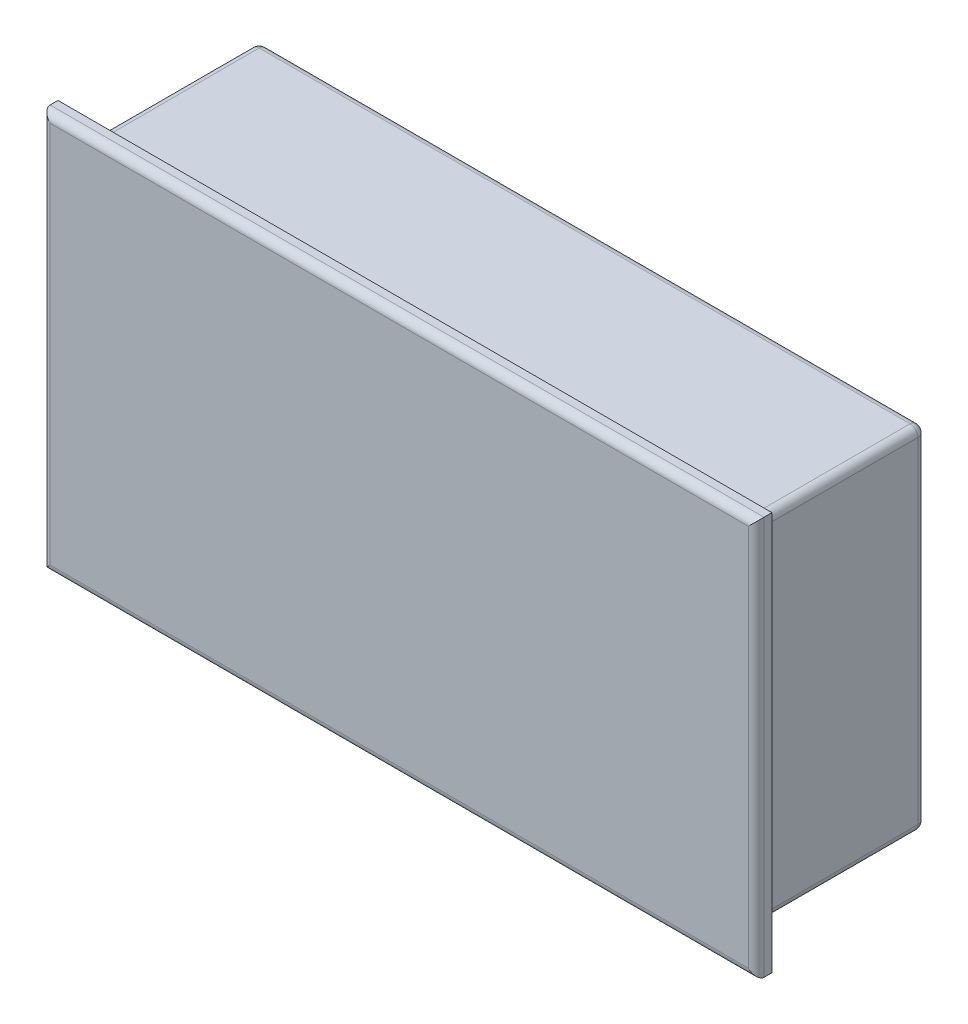
ISO-10303-21;
HEADER;
FILE_DESCRIPTION(('STEP AP214'),'2;1');
FILE_NAME('part.step','',(''),(''),'','','');
FILE_SCHEMA(('AUTOMOTIVE_DESIGN { 1 0 10303 214 1 1 1 1 }'));
ENDSEC;
DATA;
#1=APPLICATION_CONTEXT('core data for automotive mechanical design processes');
#2=APPLICATION_PROTOCOL_DEFINITION('international standard','automotive_design',2000,#1);
#3=PRODUCT_CONTEXT('',#1,'mechanical');
#4=PRODUCT('Part','Part','',(#3));
#5=PRODUCT_RELATED_PRODUCT_CATEGORY('part','',(#4));
#6=PRODUCT_DEFINITION_FORMATION('','',#4);
#7=PRODUCT_DEFINITION_CONTEXT('part definition',#1,'design');
#8=PRODUCT_DEFINITION('design','',#6,#7);
#9=PRODUCT_DEFINITION_SHAPE('','',#8);
#10=(LENGTH_UNIT() NAMED_UNIT(*) SI_UNIT(.MILLI.,.METRE.));
#11=(NAMED_UNIT(*) PLANE_ANGLE_UNIT() SI_UNIT($,.RADIAN.));
#12=(NAMED_UNIT(*) SI_UNIT($,.STERADIAN.) SOLID_ANGLE_UNIT());
#13=UNCERTAINTY_MEASURE_WITH_UNIT(LENGTH_MEASURE(1.E-05),#10,'distance_accuracy_value','');
#14=(GEOMETRIC_REPRESENTATION_CONTEXT(3) GLOBAL_UNCERTAINTY_ASSIGNED_CONTEXT((#13)) GLOBAL_UNIT_ASSIGNED_CONTEXT((#10,
#11,#12)) REPRESENTATION_CONTEXT('',''));
#15=CARTESIAN_POINT('',(0.,0.,0.));
#16=DIRECTION('',(0.,0.,1.));
#17=DIRECTION('',(1.,0.,0.));
#18=AXIS2_PLACEMENT_3D('',#15,#16,#17);
#19=CARTESIAN_POINT('',(42.25,22.25,-22.5));
#20=DIRECTION('',(1.,0.,0.));
#21=DIRECTION('',(0.,0.,-1.));
#22=AXIS2_PLACEMENT_3D('',#19,#20,#21);
#23=PLANE('',#22);
#24=DIRECTION('',(0.,1.,0.));
#25=VECTOR('',#24,1.);
#26=CARTESIAN_POINT('',(42.25,22.25,-21.5));
#27=LINE('',#26,#25);
#28=CARTESIAN_POINT('',(42.25,-21.25,-21.5));
#29=VERTEX_POINT('',#28);
#30=CARTESIAN_POINT('',(42.25,21.25,-21.5));
#31=VERTEX_POINT('',#30);
#32=EDGE_CURVE('E224',#29,#31,#27,.T.);
#33=ORIENTED_EDGE('',*,*,#32,.T.);
#34=DIRECTION('',(0.,0.,1.));
#35=VECTOR('',#34,1.);
#36=CARTESIAN_POINT('',(42.25,21.25,-22.5));
#37=LINE('',#36,#35);
#38=CARTESIAN_POINT('',(42.25,21.25,0.));
#39=VERTEX_POINT('',#38);
#40=EDGE_CURVE('E226',#31,#39,#37,.T.);
#41=ORIENTED_EDGE('',*,*,#40,.T.);
#42=DIRECTION('',(0.,1.,0.));
#43=VECTOR('',#42,1.);
#44=CARTESIAN_POINT('',(42.25,22.25,0.));
#45=LINE('',#44,#43);
#46=CARTESIAN_POINT('',(42.25,-21.25,0.));
#47=VERTEX_POINT('',#46);
#48=EDGE_CURVE('E154',#47,#39,#45,.T.);
#49=ORIENTED_EDGE('',*,*,#48,.F.);
#50=DIRECTION('',(0.,0.,1.));
#51=VECTOR('',#50,1.);
#52=CARTESIAN_POINT('',(42.25,-21.25,-22.5));
#53=LINE('',#52,#51);
#54=EDGE_CURVE('E222',#47,#29,#53,.F.);
#55=ORIENTED_EDGE('',*,*,#54,.T.);
#56=EDGE_LOOP('',(#33,#41,#49,#55));
#57=FACE_BOUND('',#56,.T.);
#58=ADVANCED_FACE('F33',(#57),#23,.T.);
#59=CARTESIAN_POINT('',(-42.25,-22.25,-22.5));
#60=DIRECTION('',(0.,-1.,0.));
#61=DIRECTION('',(0.,0.,-1.));
#62=AXIS2_PLACEMENT_3D('',#59,#60,#61);
#63=PLANE('',#62);
#64=DIRECTION('',(1.,0.,0.));
#65=VECTOR('',#64,1.);
#66=CARTESIAN_POINT('',(-42.25,-22.25,0.));
#67=LINE('',#66,#65);
#68=CARTESIAN_POINT('',(-41.25,-22.25,0.));
#69=VERTEX_POINT('',#68);
#70=CARTESIAN_POINT('',(41.25,-22.25,0.));
#71=VERTEX_POINT('',#70);
#72=EDGE_CURVE('E191',#69,#71,#67,.T.);
#73=ORIENTED_EDGE('',*,*,#72,.F.);
#74=DIRECTION('',(0.,0.,1.));
#75=VECTOR('',#74,1.);
#76=CARTESIAN_POINT('',(-41.25,-22.25,-22.5));
#77=LINE('',#76,#75);
#78=CARTESIAN_POINT('',(-41.25,-22.25,-21.5));
#79=VERTEX_POINT('',#78);
#80=EDGE_CURVE('E220',#69,#79,#77,.F.);
#81=ORIENTED_EDGE('',*,*,#80,.T.);
#82=DIRECTION('',(1.,0.,0.));
#83=VECTOR('',#82,1.);
#84=CARTESIAN_POINT('',(42.25,-22.25,-21.5));
#85=LINE('',#84,#83);
#86=CARTESIAN_POINT('',(41.25,-22.25,-21.5));
#87=VERTEX_POINT('',#86);
#88=EDGE_CURVE('E218',#79,#87,#85,.T.);
#89=ORIENTED_EDGE('',*,*,#88,.T.);
#90=DIRECTION('',(0.,0.,1.));
#91=VECTOR('',#90,1.);
#92=CARTESIAN_POINT('',(41.25,-22.25,-22.5));
#93=LINE('',#92,#91);
#94=EDGE_CURVE('E216',#87,#71,#93,.T.);
#95=ORIENTED_EDGE('',*,*,#94,.T.);
#96=EDGE_LOOP('',(#73,#81,#89,#95));
#97=FACE_BOUND('',#96,.T.);
#98=ADVANCED_FACE('F319',(#97),#63,.T.);
#99=CARTESIAN_POINT('',(-42.25,22.25,-22.5));
#100=DIRECTION('',(-1.,0.,0.));
#101=DIRECTION('',(0.,-1.,0.));
#102=AXIS2_PLACEMENT_3D('',#99,#100,#101);
#103=PLANE('',#102);
#104=DIRECTION('',(0.,-1.,0.));
#105=VECTOR('',#104,1.);
#106=CARTESIAN_POINT('',(-42.25,-22.25,-21.5));
#107=LINE('',#106,#105);
#108=CARTESIAN_POINT('',(-42.25,21.25,-21.5));
#109=VERTEX_POINT('',#108);
#110=CARTESIAN_POINT('',(-42.25,-21.25,-21.5));
#111=VERTEX_POINT('',#110);
#112=EDGE_CURVE('E212',#109,#111,#107,.T.);
#113=ORIENTED_EDGE('',*,*,#112,.T.);
#114=DIRECTION('',(0.,0.,1.));
#115=VECTOR('',#114,1.);
#116=CARTESIAN_POINT('',(-42.25,-21.25,-22.5));
#117=LINE('',#116,#115);
#118=CARTESIAN_POINT('',(-42.25,-21.25,0.));
#119=VERTEX_POINT('',#118);
#120=EDGE_CURVE('E214',#111,#119,#117,.T.);
#121=ORIENTED_EDGE('',*,*,#120,.T.);
#122=DIRECTION('',(0.,-1.,0.));
#123=VECTOR('',#122,1.);
#124=CARTESIAN_POINT('',(-42.25,22.25,0.));
#125=LINE('',#124,#123);
#126=CARTESIAN_POINT('',(-42.25,21.25,0.));
#127=VERTEX_POINT('',#126);
#128=EDGE_CURVE('E188',#127,#119,#125,.T.);
#129=ORIENTED_EDGE('',*,*,#128,.F.);
#130=DIRECTION('',(0.,0.,1.));
#131=VECTOR('',#130,1.);
#132=CARTESIAN_POINT('',(-42.25,21.25,-22.5));
#133=LINE('',#132,#131);
#134=EDGE_CURVE('E210',#127,#109,#133,.F.);
#135=ORIENTED_EDGE('',*,*,#134,.T.);
#136=EDGE_LOOP('',(#113,#121,#129,#135));
#137=FACE_BOUND('',#136,.T.);
#138=ADVANCED_FACE('F325',(#137),#103,.T.);
#139=CARTESIAN_POINT('',(-42.25,22.25,-22.5));
#140=DIRECTION('',(0.,1.,0.));
#141=DIRECTION('',(0.,0.,1.));
#142=AXIS2_PLACEMENT_3D('',#139,#140,#141);
#143=PLANE('',#142);
#144=DIRECTION('',(-1.,0.,0.));
#145=VECTOR('',#144,1.);
#146=CARTESIAN_POINT('',(-42.25,22.25,0.));
#147=LINE('',#146,#145);
#148=CARTESIAN_POINT('',(41.25,22.25,0.));
#149=VERTEX_POINT('',#148);
#150=CARTESIAN_POINT('',(-41.25,22.25,0.));
#151=VERTEX_POINT('',#150);
#152=EDGE_CURVE('E185',#149,#151,#147,.T.);
#153=ORIENTED_EDGE('',*,*,#152,.F.);
#154=DIRECTION('',(0.,0.,1.));
#155=VECTOR('',#154,1.);
#156=CARTESIAN_POINT('',(41.25,22.25,-22.5));
#157=LINE('',#156,#155);
#158=CARTESIAN_POINT('',(41.25,22.25,-21.5));
#159=VERTEX_POINT('',#158);
#160=EDGE_CURVE('E199',#149,#159,#157,.F.);
#161=ORIENTED_EDGE('',*,*,#160,.T.);
#162=DIRECTION('',(-1.,0.,0.));
#163=VECTOR('',#162,1.);
#164=CARTESIAN_POINT('',(-42.25,22.25,-21.5));
#165=LINE('',#164,#163);
#166=CARTESIAN_POINT('',(-41.25,22.25,-21.5));
#167=VERTEX_POINT('',#166);
#168=EDGE_CURVE('E196',#159,#167,#165,.T.);
#169=ORIENTED_EDGE('',*,*,#168,.T.);
#170=DIRECTION('',(0.,0.,1.));
#171=VECTOR('',#170,1.);
#172=CARTESIAN_POINT('',(-41.25,22.25,-22.5));
#173=LINE('',#172,#171);
#174=EDGE_CURVE('E194',#167,#151,#173,.T.);
#175=ORIENTED_EDGE('',*,*,#174,.T.);
#176=EDGE_LOOP('',(#153,#161,#169,#175));
#177=FACE_BOUND('',#176,.T.);
#178=ADVANCED_FACE('F330',(#177),#143,.T.);
#179=CARTESIAN_POINT('',(0.,0.,-22.5));
#180=DIRECTION('',(0.,0.,1.));
#181=DIRECTION('',(1.,0.,0.));
#182=AXIS2_PLACEMENT_3D('',#179,#180,#181);
#183=PLANE('',#182);
#184=DIRECTION('',(0.,-1.,0.));
#185=VECTOR('',#184,1.);
#186=CARTESIAN_POINT('',(-41.25,22.25,-22.5));
#187=LINE('',#186,#185);
#188=CARTESIAN_POINT('',(-41.25,-21.25,-22.5));
#189=VERTEX_POINT('',#188);
#190=CARTESIAN_POINT('',(-41.25,21.25,-22.5));
#191=VERTEX_POINT('',#190);
#192=EDGE_CURVE('E205',#189,#191,#187,.F.);
#193=ORIENTED_EDGE('',*,*,#192,.T.);
#194=DIRECTION('',(-1.,0.,0.));
#195=VECTOR('',#194,1.);
#196=CARTESIAN_POINT('',(42.25,21.25,-22.5));
#197=LINE('',#196,#195);
#198=CARTESIAN_POINT('',(41.25,21.25,-22.5));
#199=VERTEX_POINT('',#198);
#200=EDGE_CURVE('E207',#191,#199,#197,.F.);
#201=ORIENTED_EDGE('',*,*,#200,.T.);
#202=DIRECTION('',(0.,1.,0.));
#203=VECTOR('',#202,1.);
#204=CARTESIAN_POINT('',(41.25,-22.25,-22.5));
#205=LINE('',#204,#203);
#206=CARTESIAN_POINT('',(41.25,-21.25,-22.5));
#207=VERTEX_POINT('',#206);
#208=EDGE_CURVE('E201',#199,#207,#205,.F.);
#209=ORIENTED_EDGE('',*,*,#208,.T.);
#210=DIRECTION('',(1.,0.,0.));
#211=VECTOR('',#210,1.);
#212=CARTESIAN_POINT('',(-42.25,-21.25,-22.5));
#213=LINE('',#212,#211);
#214=EDGE_CURVE('E203',#207,#189,#213,.F.);
#215=ORIENTED_EDGE('',*,*,#214,.T.);
#216=EDGE_LOOP('',(#193,#201,#209,#215));
#217=FACE_BOUND('',#216,.T.);
#218=ADVANCED_FACE('F475',(#217),#183,.F.);
#219=CARTESIAN_POINT('',(0.,0.,0.));
#220=DIRECTION('',(0.,0.,1.));
#221=DIRECTION('',(1.,0.,0.));
#222=AXIS2_PLACEMENT_3D('',#219,#220,#221);
#223=PLANE('',#222);
#224=DIRECTION('',(0.,-1.,0.));
#225=VECTOR('',#224,1.);
#226=CARTESIAN_POINT('',(-45.25,-25.25,0.));
#227=LINE('',#226,#225);
#228=CARTESIAN_POINT('',(-45.25,25.25,0.));
#229=VERTEX_POINT('',#228);
#230=CARTESIAN_POINT('',(-45.25,-25.25,0.));
#231=VERTEX_POINT('',#230);
#232=EDGE_CURVE('E162',#229,#231,#227,.T.);
#233=ORIENTED_EDGE('',*,*,#232,.F.);
#234=DIRECTION('',(-1.,0.,0.));
#235=VECTOR('',#234,1.);
#236=CARTESIAN_POINT('',(45.25,25.25,0.));
#237=LINE('',#236,#235);
#238=CARTESIAN_POINT('',(45.25,25.25,0.));
#239=VERTEX_POINT('',#238);
#240=EDGE_CURVE('E177',#239,#229,#237,.T.);
#241=ORIENTED_EDGE('',*,*,#240,.F.);
#242=DIRECTION('',(0.,1.,0.));
#243=VECTOR('',#242,1.);
#244=CARTESIAN_POINT('',(45.25,-25.25,0.));
#245=LINE('',#244,#243);
#246=CARTESIAN_POINT('',(45.25,-25.25,0.));
#247=VERTEX_POINT('',#246);
#248=EDGE_CURVE('E164',#247,#239,#245,.T.);
#249=ORIENTED_EDGE('',*,*,#248,.F.);
#250=DIRECTION('',(1.,0.,0.));
#251=VECTOR('',#250,1.);
#252=CARTESIAN_POINT('',(45.25,-25.25,0.));
#253=LINE('',#252,#251);
#254=EDGE_CURVE('E149',#231,#247,#253,.T.);
#255=ORIENTED_EDGE('',*,*,#254,.F.);
#256=EDGE_LOOP('',(#233,#241,#249,#255));
#257=FACE_BOUND('',#256,.T.);
#258=ORIENTED_EDGE('',*,*,#128,.T.);
#259=CARTESIAN_POINT('',(-41.25,-21.25,0.));
#260=DIRECTION('',(0.,0.,1.));
#261=DIRECTION('',(1.,0.,0.));
#262=AXIS2_PLACEMENT_3D('',#259,#260,#261);
#263=CIRCLE('',#262,1.);
#264=EDGE_CURVE('E244',#119,#69,#263,.T.);
#265=ORIENTED_EDGE('',*,*,#264,.T.);
#266=ORIENTED_EDGE('',*,*,#72,.T.);
#267=CARTESIAN_POINT('',(41.25,-21.25,0.));
#268=DIRECTION('',(0.,0.,1.));
#269=DIRECTION('',(1.,0.,0.));
#270=AXIS2_PLACEMENT_3D('',#267,#268,#269);
#271=CIRCLE('',#270,1.);
#272=EDGE_CURVE('E42',#71,#47,#271,.T.);
#273=ORIENTED_EDGE('',*,*,#272,.T.);
#274=ORIENTED_EDGE('',*,*,#48,.T.);
#275=CARTESIAN_POINT('',(41.25,21.25,0.));
#276=DIRECTION('',(0.,0.,1.));
#277=DIRECTION('',(1.,0.,0.));
#278=AXIS2_PLACEMENT_3D('',#275,#276,#277);
#279=CIRCLE('',#278,1.);
#280=EDGE_CURVE('E246',#39,#149,#279,.T.);
#281=ORIENTED_EDGE('',*,*,#280,.T.);
#282=ORIENTED_EDGE('',*,*,#152,.T.);
#283=CARTESIAN_POINT('',(-41.25,21.25,0.));
#284=DIRECTION('',(0.,0.,1.));
#285=DIRECTION('',(1.,0.,0.));
#286=AXIS2_PLACEMENT_3D('',#283,#284,#285);
#287=CIRCLE('',#286,1.);
#288=EDGE_CURVE('E11',#151,#127,#287,.T.);
#289=ORIENTED_EDGE('',*,*,#288,.T.);
#290=EDGE_LOOP('',(#258,#265,#266,#273,#274,#281,#282,#289));
#291=FACE_BOUND('',#290,.T.);
#292=ADVANCED_FACE('F159',(#257,#291),#223,.F.);
#293=CARTESIAN_POINT('',(-45.25,-25.25,2.));
#294=DIRECTION('',(1.,0.,0.));
#295=DIRECTION('',(0.,0.,-1.));
#296=AXIS2_PLACEMENT_3D('',#293,#294,#295);
#297=PLANE('',#296);
#298=DIRECTION('',(0.,0.,-1.));
#299=VECTOR('',#298,1.);
#300=CARTESIAN_POINT('',(-45.25,-25.25,2.));
#301=LINE('',#300,#299);
#302=CARTESIAN_POINT('',(-45.25,-25.25,1.));
#303=VERTEX_POINT('',#302);
#304=EDGE_CURVE('E146',#303,#231,#301,.T.);
#305=ORIENTED_EDGE('',*,*,#304,.F.);
#306=DIRECTION('',(0.,-1.,0.));
#307=VECTOR('',#306,1.);
#308=CARTESIAN_POINT('',(-45.25,25.25,1.));
#309=LINE('',#308,#307);
#310=CARTESIAN_POINT('',(-45.25,25.25,1.));
#311=VERTEX_POINT('',#310);
#312=EDGE_CURVE('E242',#303,#311,#309,.F.);
#313=ORIENTED_EDGE('',*,*,#312,.T.);
#314=DIRECTION('',(0.,0.,-1.));
#315=VECTOR('',#314,1.);
#316=CARTESIAN_POINT('',(-45.25,25.25,2.));
#317=LINE('',#316,#315);
#318=EDGE_CURVE('E168',#311,#229,#317,.T.);
#319=ORIENTED_EDGE('',*,*,#318,.T.);
#320=ORIENTED_EDGE('',*,*,#232,.T.);
#321=EDGE_LOOP('',(#305,#313,#319,#320));
#322=FACE_BOUND('',#321,.T.);
#323=ADVANCED_FACE('F166',(#322),#297,.F.);
#324=CARTESIAN_POINT('',(45.25,-25.25,2.));
#325=DIRECTION('',(0.,1.,0.));
#326=DIRECTION('',(0.,0.,1.));
#327=AXIS2_PLACEMENT_3D('',#324,#325,#326);
#328=PLANE('',#327);
#329=DIRECTION('',(0.,0.,-1.));
#330=VECTOR('',#329,1.);
#331=CARTESIAN_POINT('',(45.25,-25.25,2.));
#332=LINE('',#331,#330);
#333=CARTESIAN_POINT('',(45.25,-25.25,1.));
#334=VERTEX_POINT('',#333);
#335=EDGE_CURVE('E155',#334,#247,#332,.T.);
#336=ORIENTED_EDGE('',*,*,#335,.F.);
#337=DIRECTION('',(1.,0.,0.));
#338=VECTOR('',#337,1.);
#339=CARTESIAN_POINT('',(-45.25,-25.25,1.));
#340=LINE('',#339,#338);
#341=EDGE_CURVE('E50',#334,#303,#340,.F.);
#342=ORIENTED_EDGE('',*,*,#341,.T.);
#343=ORIENTED_EDGE('',*,*,#304,.T.);
#344=ORIENTED_EDGE('',*,*,#254,.T.);
#345=EDGE_LOOP('',(#336,#342,#343,#344));
#346=FACE_BOUND('',#345,.T.);
#347=ADVANCED_FACE('F148',(#346),#328,.F.);
#348=CARTESIAN_POINT('',(45.25,-25.25,2.));
#349=DIRECTION('',(-1.,0.,0.));
#350=DIRECTION('',(0.,0.,1.));
#351=AXIS2_PLACEMENT_3D('',#348,#349,#350);
#352=PLANE('',#351);
#353=DIRECTION('',(0.,0.,-1.));
#354=VECTOR('',#353,1.);
#355=CARTESIAN_POINT('',(45.25,25.25,2.));
#356=LINE('',#355,#354);
#357=CARTESIAN_POINT('',(45.25,25.25,1.));
#358=VERTEX_POINT('',#357);
#359=EDGE_CURVE('E180',#358,#239,#356,.T.);
#360=ORIENTED_EDGE('',*,*,#359,.F.);
#361=DIRECTION('',(0.,1.,0.));
#362=VECTOR('',#361,1.);
#363=CARTESIAN_POINT('',(45.25,-25.25,1.));
#364=LINE('',#363,#362);
#365=EDGE_CURVE('E58',#358,#334,#364,.F.);
#366=ORIENTED_EDGE('',*,*,#365,.T.);
#367=ORIENTED_EDGE('',*,*,#335,.T.);
#368=ORIENTED_EDGE('',*,*,#248,.T.);
#369=EDGE_LOOP('',(#360,#366,#367,#368));
#370=FACE_BOUND('',#369,.T.);
#371=ADVANCED_FACE('F315',(#370),#352,.F.);
#372=CARTESIAN_POINT('',(45.25,25.25,2.));
#373=DIRECTION('',(0.,-1.,0.));
#374=DIRECTION('',(0.,0.,-1.));
#375=AXIS2_PLACEMENT_3D('',#372,#373,#374);
#376=PLANE('',#375);
#377=ORIENTED_EDGE('',*,*,#318,.F.);
#378=DIRECTION('',(-1.,0.,0.));
#379=VECTOR('',#378,1.);
#380=CARTESIAN_POINT('',(45.25,25.25,1.));
#381=LINE('',#380,#379);
#382=EDGE_CURVE('E237',#311,#358,#381,.F.);
#383=ORIENTED_EDGE('',*,*,#382,.T.);
#384=ORIENTED_EDGE('',*,*,#359,.T.);
#385=ORIENTED_EDGE('',*,*,#240,.T.);
#386=EDGE_LOOP('',(#377,#383,#384,#385));
#387=FACE_BOUND('',#386,.T.);
#388=ADVANCED_FACE('F299',(#387),#376,.F.);
#389=CARTESIAN_POINT('',(0.,0.,2.));
#390=DIRECTION('',(0.,0.,1.));
#391=DIRECTION('',(1.,0.,0.));
#392=AXIS2_PLACEMENT_3D('',#389,#390,#391);
#393=PLANE('',#392);
#394=DIRECTION('',(0.,1.,0.));
#395=VECTOR('',#394,1.);
#396=CARTESIAN_POINT('',(44.25,25.25,2.));
#397=LINE('',#396,#395);
#398=CARTESIAN_POINT('',(44.25,-24.25,2.));
#399=VERTEX_POINT('',#398);
#400=CARTESIAN_POINT('',(44.25,24.25,2.));
#401=VERTEX_POINT('',#400);
#402=EDGE_CURVE('E232',#399,#401,#397,.T.);
#403=ORIENTED_EDGE('',*,*,#402,.T.);
#404=DIRECTION('',(-1.,0.,0.));
#405=VECTOR('',#404,1.);
#406=CARTESIAN_POINT('',(-45.25,24.25,2.));
#407=LINE('',#406,#405);
#408=CARTESIAN_POINT('',(-44.25,24.25,2.));
#409=VERTEX_POINT('',#408);
#410=EDGE_CURVE('E234',#401,#409,#407,.T.);
#411=ORIENTED_EDGE('',*,*,#410,.T.);
#412=DIRECTION('',(0.,-1.,0.));
#413=VECTOR('',#412,1.);
#414=CARTESIAN_POINT('',(-44.25,-25.25,2.));
#415=LINE('',#414,#413);
#416=CARTESIAN_POINT('',(-44.25,-24.25,2.));
#417=VERTEX_POINT('',#416);
#418=EDGE_CURVE('E228',#409,#417,#415,.T.);
#419=ORIENTED_EDGE('',*,*,#418,.T.);
#420=DIRECTION('',(1.,0.,0.));
#421=VECTOR('',#420,1.);
#422=CARTESIAN_POINT('',(45.25,-24.25,2.));
#423=LINE('',#422,#421);
#424=EDGE_CURVE('E230',#417,#399,#423,.T.);
#425=ORIENTED_EDGE('',*,*,#424,.T.);
#426=EDGE_LOOP('',(#403,#411,#419,#425));
#427=FACE_BOUND('',#426,.T.);
#428=ADVANCED_FACE('F304',(#427),#393,.T.);
#429=CARTESIAN_POINT('',(41.25,-21.25,-22.5));
#430=DIRECTION('',(0.,0.,1.));
#431=DIRECTION('',(1.,0.,0.));
#432=AXIS2_PLACEMENT_3D('',#429,#430,#431);
#433=CYLINDRICAL_SURFACE('',#432,1.);
#434=ORIENTED_EDGE('',*,*,#272,.F.);
#435=ORIENTED_EDGE('',*,*,#94,.F.);
#436=CARTESIAN_POINT('',(41.25,-21.25,-21.5));
#437=DIRECTION('',(0.,0.,-1.));
#438=DIRECTION('',(-1.,0.,0.));
#439=AXIS2_PLACEMENT_3D('',#436,#437,#438);
#440=CIRCLE('',#439,1.);
#441=EDGE_CURVE('E173',#29,#87,#440,.T.);
#442=ORIENTED_EDGE('',*,*,#441,.F.);
#443=ORIENTED_EDGE('',*,*,#54,.F.);
#444=EDGE_LOOP('',(#434,#435,#442,#443));
#445=FACE_BOUND('',#444,.T.);
#446=ADVANCED_FACE('F306',(#445),#433,.T.);
#447=CARTESIAN_POINT('',(-41.25,-21.25,-22.5));
#448=DIRECTION('',(0.,0.,1.));
#449=DIRECTION('',(1.,0.,0.));
#450=AXIS2_PLACEMENT_3D('',#447,#448,#449);
#451=CYLINDRICAL_SURFACE('',#450,1.);
#452=ORIENTED_EDGE('',*,*,#264,.F.);
#453=ORIENTED_EDGE('',*,*,#120,.F.);
#454=CARTESIAN_POINT('',(-41.25,-21.25,-21.5));
#455=DIRECTION('',(0.,0.,-1.));
#456=DIRECTION('',(-1.,0.,0.));
#457=AXIS2_PLACEMENT_3D('',#454,#455,#456);
#458=CIRCLE('',#457,1.);
#459=EDGE_CURVE('E274',#79,#111,#458,.T.);
#460=ORIENTED_EDGE('',*,*,#459,.F.);
#461=ORIENTED_EDGE('',*,*,#80,.F.);
#462=EDGE_LOOP('',(#452,#453,#460,#461));
#463=FACE_BOUND('',#462,.T.);
#464=ADVANCED_FACE('F312',(#463),#451,.T.);
#465=CARTESIAN_POINT('',(-42.25,-21.25,-21.5));
#466=DIRECTION('',(-1.,0.,0.));
#467=DIRECTION('',(0.,0.,1.));
#468=AXIS2_PLACEMENT_3D('',#465,#466,#467);
#469=CYLINDRICAL_SURFACE('',#468,1.);
#470=CARTESIAN_POINT('',(41.25,-21.25,-21.5));
#471=DIRECTION('',(1.,0.,0.));
#472=DIRECTION('',(0.,0.,-1.));
#473=AXIS2_PLACEMENT_3D('',#470,#471,#472);
#474=CIRCLE('',#473,1.);
#475=EDGE_CURVE('E170',#87,#207,#474,.T.);
#476=ORIENTED_EDGE('',*,*,#475,.F.);
#477=ORIENTED_EDGE('',*,*,#88,.F.);
#478=CARTESIAN_POINT('',(-41.25,-21.25,-21.5));
#479=DIRECTION('',(-1.,0.,0.));
#480=DIRECTION('',(0.,0.,1.));
#481=AXIS2_PLACEMENT_3D('',#478,#479,#480);
#482=CIRCLE('',#481,1.);
#483=EDGE_CURVE('E271',#189,#79,#482,.T.);
#484=ORIENTED_EDGE('',*,*,#483,.F.);
#485=ORIENTED_EDGE('',*,*,#214,.F.);
#486=EDGE_LOOP('',(#476,#477,#484,#485));
#487=FACE_BOUND('',#486,.T.);
#488=ADVANCED_FACE('F367',(#487),#469,.T.);
#489=CARTESIAN_POINT('',(41.25,-21.25,-21.5));
#490=DIRECTION('',(0.,0.,1.));
#491=DIRECTION('',(1.,0.,0.));
#492=AXIS2_PLACEMENT_3D('',#489,#490,#491);
#493=SPHERICAL_SURFACE('',#492,1.);
#494=ORIENTED_EDGE('',*,*,#441,.T.);
#495=ORIENTED_EDGE('',*,*,#475,.T.);
#496=CARTESIAN_POINT('',(41.25,-21.25,-21.5));
#497=DIRECTION('',(0.,-1.,0.));
#498=DIRECTION('',(0.,0.,-1.));
#499=AXIS2_PLACEMENT_3D('',#496,#497,#498);
#500=CIRCLE('',#499,1.);
#501=EDGE_CURVE('E268',#29,#207,#500,.F.);
#502=ORIENTED_EDGE('',*,*,#501,.F.);
#503=EDGE_LOOP('',(#494,#495,#502));
#504=FACE_BOUND('',#503,.T.);
#505=ADVANCED_FACE('F363',(#504),#493,.T.);
#506=CARTESIAN_POINT('',(-41.25,-21.25,-21.5));
#507=DIRECTION('',(0.,0.,1.));
#508=DIRECTION('',(1.,0.,0.));
#509=AXIS2_PLACEMENT_3D('',#506,#507,#508);
#510=SPHERICAL_SURFACE('',#509,1.);
#511=ORIENTED_EDGE('',*,*,#483,.T.);
#512=ORIENTED_EDGE('',*,*,#459,.T.);
#513=CARTESIAN_POINT('',(-41.25,-21.25,-21.5));
#514=DIRECTION('',(0.,-1.,0.));
#515=DIRECTION('',(0.,0.,-1.));
#516=AXIS2_PLACEMENT_3D('',#513,#514,#515);
#517=CIRCLE('',#516,1.);
#518=EDGE_CURVE('E265',#189,#111,#517,.F.);
#519=ORIENTED_EDGE('',*,*,#518,.F.);
#520=EDGE_LOOP('',(#511,#512,#519));
#521=FACE_BOUND('',#520,.T.);
#522=ADVANCED_FACE('F359',(#521),#510,.T.);
#523=CARTESIAN_POINT('',(41.25,22.25,-21.5));
#524=DIRECTION('',(0.,-1.,0.));
#525=DIRECTION('',(0.,0.,-1.));
#526=AXIS2_PLACEMENT_3D('',#523,#524,#525);
#527=CYLINDRICAL_SURFACE('',#526,1.);
#528=ORIENTED_EDGE('',*,*,#501,.T.);
#529=ORIENTED_EDGE('',*,*,#208,.F.);
#530=CARTESIAN_POINT('',(41.25,21.25,-21.5));
#531=DIRECTION('',(0.,1.,0.));
#532=DIRECTION('',(0.,0.,1.));
#533=AXIS2_PLACEMENT_3D('',#530,#531,#532);
#534=CIRCLE('',#533,1.);
#535=EDGE_CURVE('E262',#31,#199,#534,.T.);
#536=ORIENTED_EDGE('',*,*,#535,.F.);
#537=ORIENTED_EDGE('',*,*,#32,.F.);
#538=EDGE_LOOP('',(#528,#529,#536,#537));
#539=FACE_BOUND('',#538,.T.);
#540=ADVANCED_FACE('F355',(#539),#527,.T.);
#541=CARTESIAN_POINT('',(41.25,21.25,-22.5));
#542=DIRECTION('',(0.,0.,1.));
#543=DIRECTION('',(1.,0.,0.));
#544=AXIS2_PLACEMENT_3D('',#541,#542,#543);
#545=CYLINDRICAL_SURFACE('',#544,1.);
#546=ORIENTED_EDGE('',*,*,#280,.F.);
#547=ORIENTED_EDGE('',*,*,#40,.F.);
#548=CARTESIAN_POINT('',(41.25,21.25,-21.5));
#549=DIRECTION('',(0.,0.,-1.));
#550=DIRECTION('',(-1.,0.,0.));
#551=AXIS2_PLACEMENT_3D('',#548,#549,#550);
#552=CIRCLE('',#551,1.);
#553=EDGE_CURVE('E259',#159,#31,#552,.T.);
#554=ORIENTED_EDGE('',*,*,#553,.F.);
#555=ORIENTED_EDGE('',*,*,#160,.F.);
#556=EDGE_LOOP('',(#546,#547,#554,#555));
#557=FACE_BOUND('',#556,.T.);
#558=ADVANCED_FACE('F351',(#557),#545,.T.);
#559=CARTESIAN_POINT('',(-41.25,21.25,-22.5));
#560=DIRECTION('',(0.,0.,1.));
#561=DIRECTION('',(1.,0.,0.));
#562=AXIS2_PLACEMENT_3D('',#559,#560,#561);
#563=CYLINDRICAL_SURFACE('',#562,1.);
#564=ORIENTED_EDGE('',*,*,#288,.F.);
#565=ORIENTED_EDGE('',*,*,#174,.F.);
#566=CARTESIAN_POINT('',(-41.25,21.25,-21.5));
#567=DIRECTION('',(0.,0.,-1.));
#568=DIRECTION('',(-1.,0.,0.));
#569=AXIS2_PLACEMENT_3D('',#566,#567,#568);
#570=CIRCLE('',#569,1.);
#571=EDGE_CURVE('E256',#109,#167,#570,.T.);
#572=ORIENTED_EDGE('',*,*,#571,.F.);
#573=ORIENTED_EDGE('',*,*,#134,.F.);
#574=EDGE_LOOP('',(#564,#565,#572,#573));
#575=FACE_BOUND('',#574,.T.);
#576=ADVANCED_FACE('F347',(#575),#563,.T.);
#577=CARTESIAN_POINT('',(-41.25,22.25,-21.5));
#578=DIRECTION('',(0.,1.,0.));
#579=DIRECTION('',(-1.,0.,0.));
#580=AXIS2_PLACEMENT_3D('',#577,#578,#579);
#581=CYLINDRICAL_SURFACE('',#580,1.);
#582=ORIENTED_EDGE('',*,*,#518,.T.);
#583=ORIENTED_EDGE('',*,*,#112,.F.);
#584=CARTESIAN_POINT('',(-41.25,21.25,-21.5));
#585=DIRECTION('',(0.,1.,0.));
#586=DIRECTION('',(0.,0.,1.));
#587=AXIS2_PLACEMENT_3D('',#584,#585,#586);
#588=CIRCLE('',#587,1.);
#589=EDGE_CURVE('E253',#191,#109,#588,.T.);
#590=ORIENTED_EDGE('',*,*,#589,.F.);
#591=ORIENTED_EDGE('',*,*,#192,.F.);
#592=EDGE_LOOP('',(#582,#583,#590,#591));
#593=FACE_BOUND('',#592,.T.);
#594=ADVANCED_FACE('F343',(#593),#581,.T.);
#595=CARTESIAN_POINT('',(41.25,21.25,-21.5));
#596=DIRECTION('',(0.,0.,1.));
#597=DIRECTION('',(1.,0.,0.));
#598=AXIS2_PLACEMENT_3D('',#595,#596,#597);
#599=SPHERICAL_SURFACE('',#598,1.);
#600=ORIENTED_EDGE('',*,*,#553,.T.);
#601=ORIENTED_EDGE('',*,*,#535,.T.);
#602=CARTESIAN_POINT('',(41.25,21.25,-21.5));
#603=DIRECTION('',(1.,0.,0.));
#604=DIRECTION('',(0.,0.,-1.));
#605=AXIS2_PLACEMENT_3D('',#602,#603,#604);
#606=CIRCLE('',#605,1.);
#607=EDGE_CURVE('E251',#159,#199,#606,.F.);
#608=ORIENTED_EDGE('',*,*,#607,.F.);
#609=EDGE_LOOP('',(#600,#601,#608));
#610=FACE_BOUND('',#609,.T.);
#611=ADVANCED_FACE('F339',(#610),#599,.T.);
#612=CARTESIAN_POINT('',(-41.25,21.25,-21.5));
#613=DIRECTION('',(0.,0.,1.));
#614=DIRECTION('',(1.,0.,0.));
#615=AXIS2_PLACEMENT_3D('',#612,#613,#614);
#616=SPHERICAL_SURFACE('',#615,1.);
#617=ORIENTED_EDGE('',*,*,#589,.T.);
#618=ORIENTED_EDGE('',*,*,#571,.T.);
#619=CARTESIAN_POINT('',(-41.25,21.25,-21.5));
#620=DIRECTION('',(-1.,0.,0.));
#621=DIRECTION('',(0.,0.,1.));
#622=AXIS2_PLACEMENT_3D('',#619,#620,#621);
#623=CIRCLE('',#622,1.);
#624=EDGE_CURVE('E249',#191,#167,#623,.F.);
#625=ORIENTED_EDGE('',*,*,#624,.F.);
#626=EDGE_LOOP('',(#617,#618,#625));
#627=FACE_BOUND('',#626,.T.);
#628=ADVANCED_FACE('F335',(#627),#616,.T.);
#629=CARTESIAN_POINT('',(-42.25,21.25,-21.5));
#630=DIRECTION('',(1.,0.,0.));
#631=DIRECTION('',(0.,0.,-1.));
#632=AXIS2_PLACEMENT_3D('',#629,#630,#631);
#633=CYLINDRICAL_SURFACE('',#632,1.);
#634=ORIENTED_EDGE('',*,*,#607,.T.);
#635=ORIENTED_EDGE('',*,*,#200,.F.);
#636=ORIENTED_EDGE('',*,*,#624,.T.);
#637=ORIENTED_EDGE('',*,*,#168,.F.);
#638=EDGE_LOOP('',(#634,#635,#636,#637));
#639=FACE_BOUND('',#638,.T.);
#640=ADVANCED_FACE('F332',(#639),#633,.T.);
#641=CARTESIAN_POINT('',(0.,-24.25,1.));
#642=DIRECTION('',(-1.,0.,0.));
#643=DIRECTION('',(0.,0.,1.));
#644=AXIS2_PLACEMENT_3D('',#641,#642,#643);
#645=CYLINDRICAL_SURFACE('',#644,1.);
#646=CARTESIAN_POINT('',(-44.25,-24.25,1.));
#647=DIRECTION('',(-0.707106781186547,0.707106781186547,0.));
#648=DIRECTION('',(0.707106781186547,0.707106781186547,0.));
#649=AXIS2_PLACEMENT_3D('',#646,#647,#648);
#650=ELLIPSE('',#649,1.41421356237309,1.);
#651=EDGE_CURVE('E282',#303,#417,#650,.T.);
#652=ORIENTED_EDGE('',*,*,#651,.F.);
#653=ORIENTED_EDGE('',*,*,#341,.F.);
#654=CARTESIAN_POINT('',(44.25,-24.25,1.));
#655=DIRECTION('',(-0.707106781186547,-0.707106781186547,0.));
#656=DIRECTION('',(-0.707106781186547,0.707106781186547,0.));
#657=AXIS2_PLACEMENT_3D('',#654,#655,#656);
#658=ELLIPSE('',#657,1.41421356237309,1.);
#659=EDGE_CURVE('E37',#399,#334,#658,.F.);
#660=ORIENTED_EDGE('',*,*,#659,.F.);
#661=ORIENTED_EDGE('',*,*,#424,.F.);
#662=EDGE_LOOP('',(#652,#653,#660,#661));
#663=FACE_BOUND('',#662,.T.);
#664=ADVANCED_FACE('F35',(#663),#645,.T.);
#665=CARTESIAN_POINT('',(44.25,0.,1.));
#666=DIRECTION('',(0.,-1.,0.));
#667=DIRECTION('',(0.,0.,-1.));
#668=AXIS2_PLACEMENT_3D('',#665,#666,#667);
#669=CYLINDRICAL_SURFACE('',#668,1.);
#670=ORIENTED_EDGE('',*,*,#659,.T.);
#671=ORIENTED_EDGE('',*,*,#365,.F.);
#672=CARTESIAN_POINT('',(44.25,24.25,1.));
#673=DIRECTION('',(0.707106781186547,-0.707106781186547,0.));
#674=DIRECTION('',(-0.707106781186547,-0.707106781186547,0.));
#675=AXIS2_PLACEMENT_3D('',#672,#673,#674);
#676=ELLIPSE('',#675,1.41421356237309,1.);
#677=EDGE_CURVE('E281',#401,#358,#676,.F.);
#678=ORIENTED_EDGE('',*,*,#677,.F.);
#679=ORIENTED_EDGE('',*,*,#402,.F.);
#680=EDGE_LOOP('',(#670,#671,#678,#679));
#681=FACE_BOUND('',#680,.T.);
#682=ADVANCED_FACE('F291',(#681),#669,.T.);
#683=CARTESIAN_POINT('',(-44.25,0.,1.));
#684=DIRECTION('',(0.,1.,0.));
#685=DIRECTION('',(0.,0.,1.));
#686=AXIS2_PLACEMENT_3D('',#683,#684,#685);
#687=CYLINDRICAL_SURFACE('',#686,1.);
#688=ORIENTED_EDGE('',*,*,#651,.T.);
#689=ORIENTED_EDGE('',*,*,#418,.F.);
#690=CARTESIAN_POINT('',(-44.25,24.25,1.));
#691=DIRECTION('',(0.707106781186547,0.707106781186547,0.));
#692=DIRECTION('',(-0.707106781186547,0.707106781186547,0.));
#693=AXIS2_PLACEMENT_3D('',#690,#691,#692);
#694=ELLIPSE('',#693,1.41421356237309,1.);
#695=EDGE_CURVE('E279',#311,#409,#694,.T.);
#696=ORIENTED_EDGE('',*,*,#695,.F.);
#697=ORIENTED_EDGE('',*,*,#312,.F.);
#698=EDGE_LOOP('',(#688,#689,#696,#697));
#699=FACE_BOUND('',#698,.T.);
#700=ADVANCED_FACE('F296',(#699),#687,.T.);
#701=CARTESIAN_POINT('',(0.,24.25,1.));
#702=DIRECTION('',(1.,0.,0.));
#703=DIRECTION('',(0.,0.,-1.));
#704=AXIS2_PLACEMENT_3D('',#701,#702,#703);
#705=CYLINDRICAL_SURFACE('',#704,1.);
#706=ORIENTED_EDGE('',*,*,#677,.T.);
#707=ORIENTED_EDGE('',*,*,#382,.F.);
#708=ORIENTED_EDGE('',*,*,#695,.T.);
#709=ORIENTED_EDGE('',*,*,#410,.F.);
#710=EDGE_LOOP('',(#706,#707,#708,#709));
#711=FACE_BOUND('',#710,.T.);
#712=ADVANCED_FACE('F301',(#711),#705,.T.);
#713=CLOSED_SHELL('',(#58,#98,#138,#178,#218,#292,#323,#347,#371,#388,#428,#446,#464,#488,#505,
#522,#540,#558,#576,#594,#611,#628,#640,#664,#682,#700,#712));
#714=MANIFOLD_SOLID_BREP('B2',#713);
#715=ADVANCED_BREP_SHAPE_REPRESENTATION('',(#18,#714),#14);
#716=SHAPE_DEFINITION_REPRESENTATION(#9,#715);
ENDSEC;
END-ISO-10303-21;
